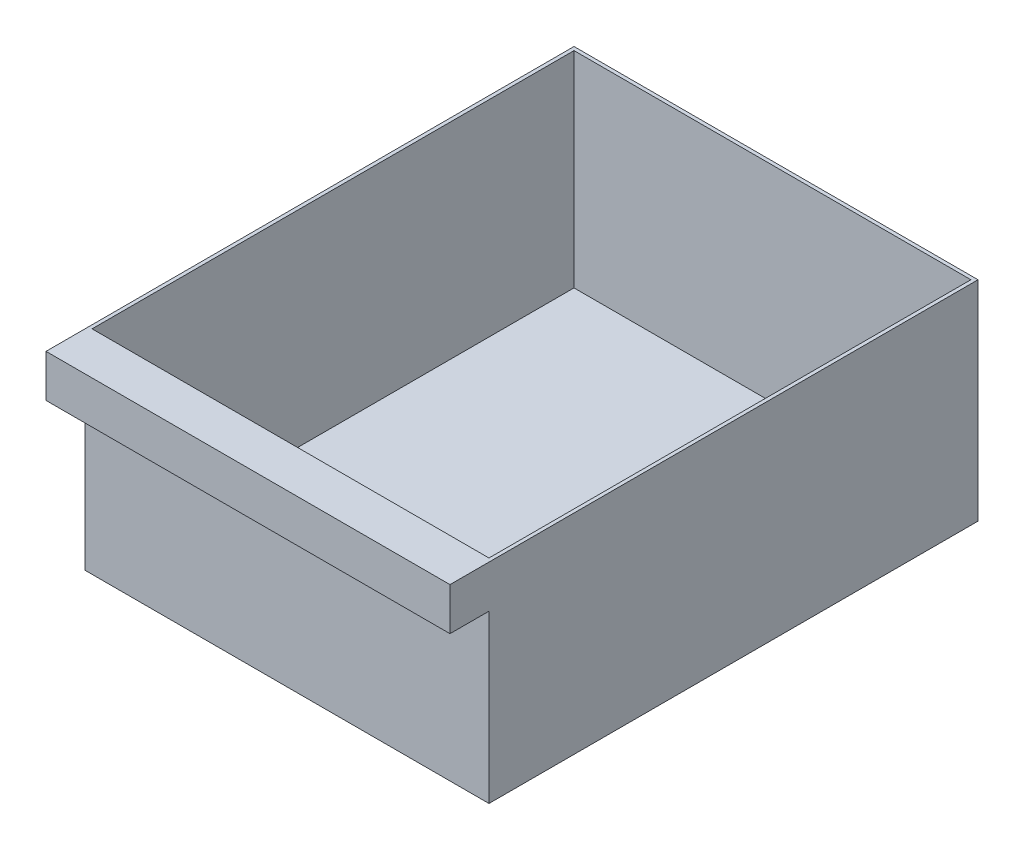
ISO-10303-21;
HEADER;
FILE_DESCRIPTION(('STEP AP214'),'2;1');
FILE_NAME('part.step','',(''),(''),'','','');
FILE_SCHEMA(('AUTOMOTIVE_DESIGN { 1 0 10303 214 1 1 1 1 }'));
ENDSEC;
DATA;
#1=APPLICATION_CONTEXT('core data for automotive mechanical design processes');
#2=APPLICATION_PROTOCOL_DEFINITION('international standard','automotive_design',2000,#1);
#3=PRODUCT_CONTEXT('',#1,'mechanical');
#4=PRODUCT('Part','Part','',(#3));
#5=PRODUCT_RELATED_PRODUCT_CATEGORY('part','',(#4));
#6=PRODUCT_DEFINITION_FORMATION('','',#4);
#7=PRODUCT_DEFINITION_CONTEXT('part definition',#1,'design');
#8=PRODUCT_DEFINITION('design','',#6,#7);
#9=PRODUCT_DEFINITION_SHAPE('','',#8);
#10=(LENGTH_UNIT() NAMED_UNIT(*) SI_UNIT(.MILLI.,.METRE.));
#11=(NAMED_UNIT(*) PLANE_ANGLE_UNIT() SI_UNIT($,.RADIAN.));
#12=(NAMED_UNIT(*) SI_UNIT($,.STERADIAN.) SOLID_ANGLE_UNIT());
#13=UNCERTAINTY_MEASURE_WITH_UNIT(LENGTH_MEASURE(1.E-05),#10,'distance_accuracy_value','');
#14=(GEOMETRIC_REPRESENTATION_CONTEXT(3) GLOBAL_UNCERTAINTY_ASSIGNED_CONTEXT((#13)) GLOBAL_UNIT_ASSIGNED_CONTEXT((#10,
#11,#12)) REPRESENTATION_CONTEXT('',''));
#15=CARTESIAN_POINT('',(0.,0.,0.));
#16=DIRECTION('',(0.,0.,1.));
#17=DIRECTION('',(1.,0.,0.));
#18=AXIS2_PLACEMENT_3D('',#15,#16,#17);
#19=CARTESIAN_POINT('',(-57.,59.,69.));
#20=DIRECTION('',(0.,0.,-1.));
#21=DIRECTION('',(-1.,0.,0.));
#22=AXIS2_PLACEMENT_3D('',#19,#20,#21);
#23=PLANE('',#22);
#24=DIRECTION('',(1.,0.,0.));
#25=VECTOR('',#24,1.);
#26=CARTESIAN_POINT('',(-57.,47.,69.));
#27=LINE('',#26,#25);
#28=CARTESIAN_POINT('',(-57.,47.,69.));
#29=VERTEX_POINT('',#28);
#30=CARTESIAN_POINT('',(-56.,47.,69.));
#31=VERTEX_POINT('',#30);
#32=EDGE_CURVE('E63',#29,#31,#27,.T.);
#33=ORIENTED_EDGE('',*,*,#32,.F.);
#34=DIRECTION('',(0.,-1.,0.));
#35=VECTOR('',#34,1.);
#36=CARTESIAN_POINT('',(-57.,59.,69.));
#37=LINE('',#36,#35);
#38=CARTESIAN_POINT('',(-57.,0.,69.));
#39=VERTEX_POINT('',#38);
#40=EDGE_CURVE('E229',#29,#39,#37,.T.);
#41=ORIENTED_EDGE('',*,*,#40,.T.);
#42=DIRECTION('',(1.,0.,0.));
#43=VECTOR('',#42,1.);
#44=CARTESIAN_POINT('',(-57.,0.,69.));
#45=LINE('',#44,#43);
#46=CARTESIAN_POINT('',(57.,0.,69.));
#47=VERTEX_POINT('',#46);
#48=EDGE_CURVE('E216',#39,#47,#45,.T.);
#49=ORIENTED_EDGE('',*,*,#48,.T.);
#50=DIRECTION('',(0.,-1.,0.));
#51=VECTOR('',#50,1.);
#52=CARTESIAN_POINT('',(57.,59.,69.));
#53=LINE('',#52,#51);
#54=CARTESIAN_POINT('',(57.,47.,69.));
#55=VERTEX_POINT('',#54);
#56=EDGE_CURVE('E165',#55,#47,#53,.T.);
#57=ORIENTED_EDGE('',*,*,#56,.F.);
#58=CARTESIAN_POINT('',(56.,47.,69.));
#59=VERTEX_POINT('',#58);
#60=EDGE_CURVE('E159',#59,#55,#27,.T.);
#61=ORIENTED_EDGE('',*,*,#60,.F.);
#62=DIRECTION('',(0.,-1.,0.));
#63=VECTOR('',#62,1.);
#64=CARTESIAN_POINT('',(56.,171.445542374965,69.));
#65=LINE('',#64,#63);
#66=CARTESIAN_POINT('',(56.,58.,69.));
#67=VERTEX_POINT('',#66);
#68=EDGE_CURVE('E143',#67,#59,#65,.T.);
#69=ORIENTED_EDGE('',*,*,#68,.F.);
#70=DIRECTION('',(-1.,0.,0.));
#71=VECTOR('',#70,1.);
#72=CARTESIAN_POINT('',(-56.,58.,69.));
#73=LINE('',#72,#71);
#74=CARTESIAN_POINT('',(-56.,58.,69.));
#75=VERTEX_POINT('',#74);
#76=EDGE_CURVE('E167',#67,#75,#73,.T.);
#77=ORIENTED_EDGE('',*,*,#76,.T.);
#78=DIRECTION('',(0.,-1.,0.));
#79=VECTOR('',#78,1.);
#80=CARTESIAN_POINT('',(-56.,171.445542374965,69.));
#81=LINE('',#80,#79);
#82=EDGE_CURVE('E154',#75,#31,#81,.T.);
#83=ORIENTED_EDGE('',*,*,#82,.T.);
#84=EDGE_LOOP('',(#33,#41,#49,#57,#61,#69,#77,#83));
#85=FACE_BOUND('',#84,.T.);
#86=ADVANCED_FACE('F41',(#85),#23,.F.);
#87=CARTESIAN_POINT('',(0.,59.,0.));
#88=DIRECTION('',(0.,-1.,0.));
#89=DIRECTION('',(0.,0.,-1.));
#90=AXIS2_PLACEMENT_3D('',#87,#88,#89);
#91=PLANE('',#90);
#92=DIRECTION('',(0.,0.,-1.));
#93=VECTOR('',#92,1.);
#94=CARTESIAN_POINT('',(57.,59.,69.));
#95=LINE('',#94,#93);
#96=CARTESIAN_POINT('',(57.,59.,80.));
#97=VERTEX_POINT('',#96);
#98=CARTESIAN_POINT('',(57.,59.,-69.));
#99=VERTEX_POINT('',#98);
#100=EDGE_CURVE('E212',#97,#99,#95,.T.);
#101=ORIENTED_EDGE('',*,*,#100,.T.);
#102=DIRECTION('',(-1.,0.,0.));
#103=VECTOR('',#102,1.);
#104=CARTESIAN_POINT('',(-57.,59.,-69.));
#105=LINE('',#104,#103);
#106=CARTESIAN_POINT('',(-57.,59.,-69.));
#107=VERTEX_POINT('',#106);
#108=EDGE_CURVE('E215',#99,#107,#105,.T.);
#109=ORIENTED_EDGE('',*,*,#108,.T.);
#110=DIRECTION('',(0.,0.,1.));
#111=VECTOR('',#110,1.);
#112=CARTESIAN_POINT('',(-57.,59.,69.));
#113=LINE('',#112,#111);
#114=CARTESIAN_POINT('',(-57.,59.,80.));
#115=VERTEX_POINT('',#114);
#116=EDGE_CURVE('E218',#107,#115,#113,.T.);
#117=ORIENTED_EDGE('',*,*,#116,.T.);
#118=DIRECTION('',(-1.,0.,0.));
#119=VECTOR('',#118,1.);
#120=CARTESIAN_POINT('',(-57.,59.,80.));
#121=LINE('',#120,#119);
#122=EDGE_CURVE('E174',#97,#115,#121,.T.);
#123=ORIENTED_EDGE('',*,*,#122,.F.);
#124=EDGE_LOOP('',(#101,#109,#117,#123));
#125=FACE_BOUND('',#124,.T.);
#126=DIRECTION('',(0.,0.,-1.));
#127=VECTOR('',#126,1.);
#128=CARTESIAN_POINT('',(56.,59.,0.));
#129=LINE('',#128,#127);
#130=CARTESIAN_POINT('',(56.,59.,68.));
#131=VERTEX_POINT('',#130);
#132=CARTESIAN_POINT('',(56.,59.,-68.));
#133=VERTEX_POINT('',#132);
#134=EDGE_CURVE('E204',#131,#133,#129,.T.);
#135=ORIENTED_EDGE('',*,*,#134,.F.);
#136=DIRECTION('',(1.,0.,0.));
#137=VECTOR('',#136,1.);
#138=CARTESIAN_POINT('',(0.,59.,68.));
#139=LINE('',#138,#137);
#140=CARTESIAN_POINT('',(-56.,59.,68.));
#141=VERTEX_POINT('',#140);
#142=EDGE_CURVE('E194',#141,#131,#139,.T.);
#143=ORIENTED_EDGE('',*,*,#142,.F.);
#144=DIRECTION('',(0.,0.,1.));
#145=VECTOR('',#144,1.);
#146=CARTESIAN_POINT('',(-56.,59.,0.));
#147=LINE('',#146,#145);
#148=CARTESIAN_POINT('',(-56.,59.,-68.));
#149=VERTEX_POINT('',#148);
#150=EDGE_CURVE('E208',#149,#141,#147,.T.);
#151=ORIENTED_EDGE('',*,*,#150,.F.);
#152=DIRECTION('',(-1.,0.,0.));
#153=VECTOR('',#152,1.);
#154=CARTESIAN_POINT('',(0.,59.,-68.));
#155=LINE('',#154,#153);
#156=EDGE_CURVE('E206',#133,#149,#155,.T.);
#157=ORIENTED_EDGE('',*,*,#156,.F.);
#158=EDGE_LOOP('',(#135,#143,#151,#157));
#159=FACE_BOUND('',#158,.T.);
#160=ADVANCED_FACE('F257',(#125,#159),#91,.F.);
#161=CARTESIAN_POINT('',(57.,59.,69.));
#162=DIRECTION('',(-1.,0.,0.));
#163=DIRECTION('',(0.,0.,1.));
#164=AXIS2_PLACEMENT_3D('',#161,#162,#163);
#165=PLANE('',#164);
#166=DIRECTION('',(0.,0.,-1.));
#167=VECTOR('',#166,1.);
#168=CARTESIAN_POINT('',(57.,0.,69.));
#169=LINE('',#168,#167);
#170=CARTESIAN_POINT('',(57.,0.,-69.));
#171=VERTEX_POINT('',#170);
#172=EDGE_CURVE('E188',#47,#171,#169,.T.);
#173=ORIENTED_EDGE('',*,*,#172,.T.);
#174=DIRECTION('',(0.,-1.,0.));
#175=VECTOR('',#174,1.);
#176=CARTESIAN_POINT('',(57.,59.,-69.));
#177=LINE('',#176,#175);
#178=EDGE_CURVE('E12',#99,#171,#177,.T.);
#179=ORIENTED_EDGE('',*,*,#178,.F.);
#180=ORIENTED_EDGE('',*,*,#100,.F.);
#181=DIRECTION('',(0.,1.,0.));
#182=VECTOR('',#181,1.);
#183=CARTESIAN_POINT('',(57.,59.,80.));
#184=LINE('',#183,#182);
#185=CARTESIAN_POINT('',(57.,47.,80.));
#186=VERTEX_POINT('',#185);
#187=EDGE_CURVE('E248',#186,#97,#184,.T.);
#188=ORIENTED_EDGE('',*,*,#187,.F.);
#189=DIRECTION('',(0.,0.,-1.));
#190=VECTOR('',#189,1.);
#191=CARTESIAN_POINT('',(57.,47.,80.));
#192=LINE('',#191,#190);
#193=EDGE_CURVE('E176',#186,#55,#192,.T.);
#194=ORIENTED_EDGE('',*,*,#193,.T.);
#195=ORIENTED_EDGE('',*,*,#56,.T.);
#196=EDGE_LOOP('',(#173,#179,#180,#188,#194,#195));
#197=FACE_BOUND('',#196,.T.);
#198=ADVANCED_FACE('F43',(#197),#165,.F.);
#199=CARTESIAN_POINT('',(-57.,59.,-69.));
#200=DIRECTION('',(0.,0.,1.));
#201=DIRECTION('',(1.,0.,0.));
#202=AXIS2_PLACEMENT_3D('',#199,#200,#201);
#203=PLANE('',#202);
#204=DIRECTION('',(-1.,0.,0.));
#205=VECTOR('',#204,1.);
#206=CARTESIAN_POINT('',(-57.,0.,-69.));
#207=LINE('',#206,#205);
#208=CARTESIAN_POINT('',(-57.,0.,-69.));
#209=VERTEX_POINT('',#208);
#210=EDGE_CURVE('E222',#171,#209,#207,.T.);
#211=ORIENTED_EDGE('',*,*,#210,.T.);
#212=DIRECTION('',(0.,-1.,0.));
#213=VECTOR('',#212,1.);
#214=CARTESIAN_POINT('',(-57.,59.,-69.));
#215=LINE('',#214,#213);
#216=EDGE_CURVE('E49',#107,#209,#215,.T.);
#217=ORIENTED_EDGE('',*,*,#216,.F.);
#218=ORIENTED_EDGE('',*,*,#108,.F.);
#219=ORIENTED_EDGE('',*,*,#178,.T.);
#220=EDGE_LOOP('',(#211,#217,#218,#219));
#221=FACE_BOUND('',#220,.T.);
#222=ADVANCED_FACE('F260',(#221),#203,.F.);
#223=CARTESIAN_POINT('',(-57.,59.,69.));
#224=DIRECTION('',(1.,0.,0.));
#225=DIRECTION('',(0.,0.,-1.));
#226=AXIS2_PLACEMENT_3D('',#223,#224,#225);
#227=PLANE('',#226);
#228=DIRECTION('',(0.,0.,1.));
#229=VECTOR('',#228,1.);
#230=CARTESIAN_POINT('',(-57.,0.,69.));
#231=LINE('',#230,#229);
#232=EDGE_CURVE('E224',#209,#39,#231,.T.);
#233=ORIENTED_EDGE('',*,*,#232,.T.);
#234=ORIENTED_EDGE('',*,*,#40,.F.);
#235=DIRECTION('',(0.,0.,-1.));
#236=VECTOR('',#235,1.);
#237=CARTESIAN_POINT('',(-57.,47.,80.));
#238=LINE('',#237,#236);
#239=CARTESIAN_POINT('',(-57.,47.,80.));
#240=VERTEX_POINT('',#239);
#241=EDGE_CURVE('E178',#240,#29,#238,.T.);
#242=ORIENTED_EDGE('',*,*,#241,.F.);
#243=DIRECTION('',(0.,-1.,0.));
#244=VECTOR('',#243,1.);
#245=CARTESIAN_POINT('',(-57.,59.,80.));
#246=LINE('',#245,#244);
#247=EDGE_CURVE('E169',#115,#240,#246,.T.);
#248=ORIENTED_EDGE('',*,*,#247,.F.);
#249=ORIENTED_EDGE('',*,*,#116,.F.);
#250=ORIENTED_EDGE('',*,*,#216,.T.);
#251=EDGE_LOOP('',(#233,#234,#242,#248,#249,#250));
#252=FACE_BOUND('',#251,.T.);
#253=ADVANCED_FACE('F235',(#252),#227,.F.);
#254=CARTESIAN_POINT('',(0.,0.,0.));
#255=DIRECTION('',(0.,-1.,0.));
#256=DIRECTION('',(0.,0.,-1.));
#257=AXIS2_PLACEMENT_3D('',#254,#255,#256);
#258=PLANE('',#257);
#259=ORIENTED_EDGE('',*,*,#172,.F.);
#260=ORIENTED_EDGE('',*,*,#48,.F.);
#261=ORIENTED_EDGE('',*,*,#232,.F.);
#262=ORIENTED_EDGE('',*,*,#210,.F.);
#263=EDGE_LOOP('',(#259,#260,#261,#262));
#264=FACE_BOUND('',#263,.T.);
#265=ADVANCED_FACE('F241',(#264),#258,.T.);
#266=CARTESIAN_POINT('',(56.,59.,69.));
#267=DIRECTION('',(-1.,0.,0.));
#268=DIRECTION('',(0.,0.,1.));
#269=AXIS2_PLACEMENT_3D('',#266,#267,#268);
#270=PLANE('',#269);
#271=DIRECTION('',(0.,0.,-1.));
#272=VECTOR('',#271,1.);
#273=CARTESIAN_POINT('',(56.,1.,0.));
#274=LINE('',#273,#272);
#275=CARTESIAN_POINT('',(56.,1.,68.));
#276=VERTEX_POINT('',#275);
#277=CARTESIAN_POINT('',(56.,1.,-68.));
#278=VERTEX_POINT('',#277);
#279=EDGE_CURVE('E181',#276,#278,#274,.T.);
#280=ORIENTED_EDGE('',*,*,#279,.F.);
#281=DIRECTION('',(0.,-1.,0.));
#282=VECTOR('',#281,1.);
#283=CARTESIAN_POINT('',(56.,59.,68.));
#284=LINE('',#283,#282);
#285=EDGE_CURVE('E190',#131,#276,#284,.T.);
#286=ORIENTED_EDGE('',*,*,#285,.F.);
#287=ORIENTED_EDGE('',*,*,#134,.T.);
#288=DIRECTION('',(0.,-1.,0.));
#289=VECTOR('',#288,1.);
#290=CARTESIAN_POINT('',(56.,59.,-68.));
#291=LINE('',#290,#289);
#292=EDGE_CURVE('E185',#133,#278,#291,.T.);
#293=ORIENTED_EDGE('',*,*,#292,.T.);
#294=EDGE_LOOP('',(#280,#286,#287,#293));
#295=FACE_BOUND('',#294,.T.);
#296=ADVANCED_FACE('F277',(#295),#270,.T.);
#297=CARTESIAN_POINT('',(-57.,59.,-68.));
#298=DIRECTION('',(0.,0.,1.));
#299=DIRECTION('',(1.,0.,0.));
#300=AXIS2_PLACEMENT_3D('',#297,#298,#299);
#301=PLANE('',#300);
#302=DIRECTION('',(-1.,0.,0.));
#303=VECTOR('',#302,1.);
#304=CARTESIAN_POINT('',(0.,1.,-68.));
#305=LINE('',#304,#303);
#306=CARTESIAN_POINT('',(-56.,1.,-68.));
#307=VERTEX_POINT('',#306);
#308=EDGE_CURVE('E184',#278,#307,#305,.T.);
#309=ORIENTED_EDGE('',*,*,#308,.F.);
#310=ORIENTED_EDGE('',*,*,#292,.F.);
#311=ORIENTED_EDGE('',*,*,#156,.T.);
#312=DIRECTION('',(0.,-1.,0.));
#313=VECTOR('',#312,1.);
#314=CARTESIAN_POINT('',(-56.,59.,-68.));
#315=LINE('',#314,#313);
#316=EDGE_CURVE('E189',#149,#307,#315,.T.);
#317=ORIENTED_EDGE('',*,*,#316,.T.);
#318=EDGE_LOOP('',(#309,#310,#311,#317));
#319=FACE_BOUND('',#318,.T.);
#320=ADVANCED_FACE('F281',(#319),#301,.T.);
#321=CARTESIAN_POINT('',(-56.,59.,69.));
#322=DIRECTION('',(1.,0.,0.));
#323=DIRECTION('',(0.,0.,-1.));
#324=AXIS2_PLACEMENT_3D('',#321,#322,#323);
#325=PLANE('',#324);
#326=DIRECTION('',(0.,0.,1.));
#327=VECTOR('',#326,1.);
#328=CARTESIAN_POINT('',(-56.,1.,0.));
#329=LINE('',#328,#327);
#330=CARTESIAN_POINT('',(-56.,1.,68.));
#331=VERTEX_POINT('',#330);
#332=EDGE_CURVE('E196',#307,#331,#329,.T.);
#333=ORIENTED_EDGE('',*,*,#332,.F.);
#334=ORIENTED_EDGE('',*,*,#316,.F.);
#335=ORIENTED_EDGE('',*,*,#150,.T.);
#336=DIRECTION('',(0.,-1.,0.));
#337=VECTOR('',#336,1.);
#338=CARTESIAN_POINT('',(-56.,59.,68.));
#339=LINE('',#338,#337);
#340=EDGE_CURVE('E193',#141,#331,#339,.T.);
#341=ORIENTED_EDGE('',*,*,#340,.T.);
#342=EDGE_LOOP('',(#333,#334,#335,#341));
#343=FACE_BOUND('',#342,.T.);
#344=ADVANCED_FACE('F287',(#343),#325,.T.);
#345=CARTESIAN_POINT('',(-57.,59.,68.));
#346=DIRECTION('',(0.,0.,-1.));
#347=DIRECTION('',(-1.,0.,0.));
#348=AXIS2_PLACEMENT_3D('',#345,#346,#347);
#349=PLANE('',#348);
#350=DIRECTION('',(1.,0.,0.));
#351=VECTOR('',#350,1.);
#352=CARTESIAN_POINT('',(0.,1.,68.));
#353=LINE('',#352,#351);
#354=EDGE_CURVE('E200',#331,#276,#353,.T.);
#355=ORIENTED_EDGE('',*,*,#354,.F.);
#356=ORIENTED_EDGE('',*,*,#340,.F.);
#357=ORIENTED_EDGE('',*,*,#142,.T.);
#358=ORIENTED_EDGE('',*,*,#285,.T.);
#359=EDGE_LOOP('',(#355,#356,#357,#358));
#360=FACE_BOUND('',#359,.T.);
#361=ADVANCED_FACE('F296',(#360),#349,.T.);
#362=CARTESIAN_POINT('',(0.,1.,0.));
#363=DIRECTION('',(0.,-1.,0.));
#364=DIRECTION('',(0.,0.,-1.));
#365=AXIS2_PLACEMENT_3D('',#362,#363,#364);
#366=PLANE('',#365);
#367=ORIENTED_EDGE('',*,*,#279,.T.);
#368=ORIENTED_EDGE('',*,*,#308,.T.);
#369=ORIENTED_EDGE('',*,*,#332,.T.);
#370=ORIENTED_EDGE('',*,*,#354,.T.);
#371=EDGE_LOOP('',(#367,#368,#369,#370));
#372=FACE_BOUND('',#371,.T.);
#373=ADVANCED_FACE('F300',(#372),#366,.F.);
#374=CARTESIAN_POINT('',(-57.,47.,80.));
#375=DIRECTION('',(0.,1.,0.));
#376=DIRECTION('',(0.,0.,1.));
#377=AXIS2_PLACEMENT_3D('',#374,#375,#376);
#378=PLANE('',#377);
#379=ORIENTED_EDGE('',*,*,#32,.T.);
#380=DIRECTION('',(0.,0.,-1.));
#381=VECTOR('',#380,1.);
#382=CARTESIAN_POINT('',(-56.,47.,79.));
#383=LINE('',#382,#381);
#384=CARTESIAN_POINT('',(-56.,47.,79.));
#385=VERTEX_POINT('',#384);
#386=EDGE_CURVE('E56',#385,#31,#383,.T.);
#387=ORIENTED_EDGE('',*,*,#386,.F.);
#388=DIRECTION('',(-1.,0.,0.));
#389=VECTOR('',#388,1.);
#390=CARTESIAN_POINT('',(-56.,47.,79.));
#391=LINE('',#390,#389);
#392=CARTESIAN_POINT('',(56.,47.,79.));
#393=VERTEX_POINT('',#392);
#394=EDGE_CURVE('E162',#393,#385,#391,.T.);
#395=ORIENTED_EDGE('',*,*,#394,.F.);
#396=DIRECTION('',(0.,0.,1.));
#397=VECTOR('',#396,1.);
#398=CARTESIAN_POINT('',(56.,47.,79.));
#399=LINE('',#398,#397);
#400=EDGE_CURVE('E147',#59,#393,#399,.T.);
#401=ORIENTED_EDGE('',*,*,#400,.F.);
#402=ORIENTED_EDGE('',*,*,#60,.T.);
#403=ORIENTED_EDGE('',*,*,#193,.F.);
#404=DIRECTION('',(1.,0.,0.));
#405=VECTOR('',#404,1.);
#406=CARTESIAN_POINT('',(-57.,47.,80.));
#407=LINE('',#406,#405);
#408=EDGE_CURVE('E243',#240,#186,#407,.T.);
#409=ORIENTED_EDGE('',*,*,#408,.F.);
#410=ORIENTED_EDGE('',*,*,#241,.T.);
#411=EDGE_LOOP('',(#379,#387,#395,#401,#402,#403,#409,#410));
#412=FACE_BOUND('',#411,.T.);
#413=ADVANCED_FACE('F157',(#412),#378,.F.);
#414=CARTESIAN_POINT('',(0.,0.,80.));
#415=DIRECTION('',(0.,0.,1.));
#416=DIRECTION('',(1.,0.,0.));
#417=AXIS2_PLACEMENT_3D('',#414,#415,#416);
#418=PLANE('',#417);
#419=ORIENTED_EDGE('',*,*,#247,.T.);
#420=ORIENTED_EDGE('',*,*,#408,.T.);
#421=ORIENTED_EDGE('',*,*,#187,.T.);
#422=ORIENTED_EDGE('',*,*,#122,.T.);
#423=EDGE_LOOP('',(#419,#420,#421,#422));
#424=FACE_BOUND('',#423,.T.);
#425=ADVANCED_FACE('F251',(#424),#418,.T.);
#426=CARTESIAN_POINT('',(-56.,171.445542374965,79.));
#427=DIRECTION('',(-1.,0.,0.));
#428=DIRECTION('',(0.,0.,1.));
#429=AXIS2_PLACEMENT_3D('',#426,#427,#428);
#430=PLANE('',#429);
#431=DIRECTION('',(0.,0.,1.));
#432=VECTOR('',#431,1.);
#433=CARTESIAN_POINT('',(-56.,58.,79.));
#434=LINE('',#433,#432);
#435=CARTESIAN_POINT('',(-56.,58.,79.));
#436=VERTEX_POINT('',#435);
#437=EDGE_CURVE('E170',#75,#436,#434,.T.);
#438=ORIENTED_EDGE('',*,*,#437,.T.);
#439=DIRECTION('',(0.,-1.,0.));
#440=VECTOR('',#439,1.);
#441=CARTESIAN_POINT('',(-56.,171.445542374965,79.));
#442=LINE('',#441,#440);
#443=EDGE_CURVE('E344',#436,#385,#442,.T.);
#444=ORIENTED_EDGE('',*,*,#443,.T.);
#445=ORIENTED_EDGE('',*,*,#386,.T.);
#446=ORIENTED_EDGE('',*,*,#82,.F.);
#447=EDGE_LOOP('',(#438,#444,#445,#446));
#448=FACE_BOUND('',#447,.T.);
#449=ADVANCED_FACE('F319',(#448),#430,.F.);
#450=CARTESIAN_POINT('',(-56.,171.445542374965,79.));
#451=DIRECTION('',(0.,0.,1.));
#452=DIRECTION('',(1.,0.,0.));
#453=AXIS2_PLACEMENT_3D('',#450,#451,#452);
#454=PLANE('',#453);
#455=DIRECTION('',(1.,0.,0.));
#456=VECTOR('',#455,1.);
#457=CARTESIAN_POINT('',(-56.,58.,79.));
#458=LINE('',#457,#456);
#459=CARTESIAN_POINT('',(56.,58.,79.));
#460=VERTEX_POINT('',#459);
#461=EDGE_CURVE('E338',#436,#460,#458,.T.);
#462=ORIENTED_EDGE('',*,*,#461,.T.);
#463=DIRECTION('',(0.,-1.,0.));
#464=VECTOR('',#463,1.);
#465=CARTESIAN_POINT('',(56.,171.445542374965,79.));
#466=LINE('',#465,#464);
#467=EDGE_CURVE('E153',#460,#393,#466,.T.);
#468=ORIENTED_EDGE('',*,*,#467,.T.);
#469=ORIENTED_EDGE('',*,*,#394,.T.);
#470=ORIENTED_EDGE('',*,*,#443,.F.);
#471=EDGE_LOOP('',(#462,#468,#469,#470));
#472=FACE_BOUND('',#471,.T.);
#473=ADVANCED_FACE('F323',(#472),#454,.F.);
#474=CARTESIAN_POINT('',(56.,171.445542374965,79.));
#475=DIRECTION('',(1.,0.,0.));
#476=DIRECTION('',(0.,0.,-1.));
#477=AXIS2_PLACEMENT_3D('',#474,#475,#476);
#478=PLANE('',#477);
#479=DIRECTION('',(0.,0.,-1.));
#480=VECTOR('',#479,1.);
#481=CARTESIAN_POINT('',(56.,58.,79.));
#482=LINE('',#481,#480);
#483=EDGE_CURVE('E150',#460,#67,#482,.T.);
#484=ORIENTED_EDGE('',*,*,#483,.T.);
#485=ORIENTED_EDGE('',*,*,#68,.T.);
#486=ORIENTED_EDGE('',*,*,#400,.T.);
#487=ORIENTED_EDGE('',*,*,#467,.F.);
#488=EDGE_LOOP('',(#484,#485,#486,#487));
#489=FACE_BOUND('',#488,.T.);
#490=ADVANCED_FACE('F145',(#489),#478,.F.);
#491=CARTESIAN_POINT('',(0.,58.,0.));
#492=DIRECTION('',(0.,-1.,0.));
#493=DIRECTION('',(0.,0.,-1.));
#494=AXIS2_PLACEMENT_3D('',#491,#492,#493);
#495=PLANE('',#494);
#496=ORIENTED_EDGE('',*,*,#437,.F.);
#497=ORIENTED_EDGE('',*,*,#76,.F.);
#498=ORIENTED_EDGE('',*,*,#483,.F.);
#499=ORIENTED_EDGE('',*,*,#461,.F.);
#500=EDGE_LOOP('',(#496,#497,#498,#499));
#501=FACE_BOUND('',#500,.T.);
#502=ADVANCED_FACE('F328',(#501),#495,.T.);
#503=CLOSED_SHELL('',(#86,#160,#198,#222,#253,#265,#296,#320,#344,#361,#373,#413,#425,#449,#473,
#490,#502));
#504=MANIFOLD_SOLID_BREP('B2',#503);
#505=ADVANCED_BREP_SHAPE_REPRESENTATION('',(#18,#504),#14);
#506=SHAPE_DEFINITION_REPRESENTATION(#9,#505);
ENDSEC;
END-ISO-10303-21;
